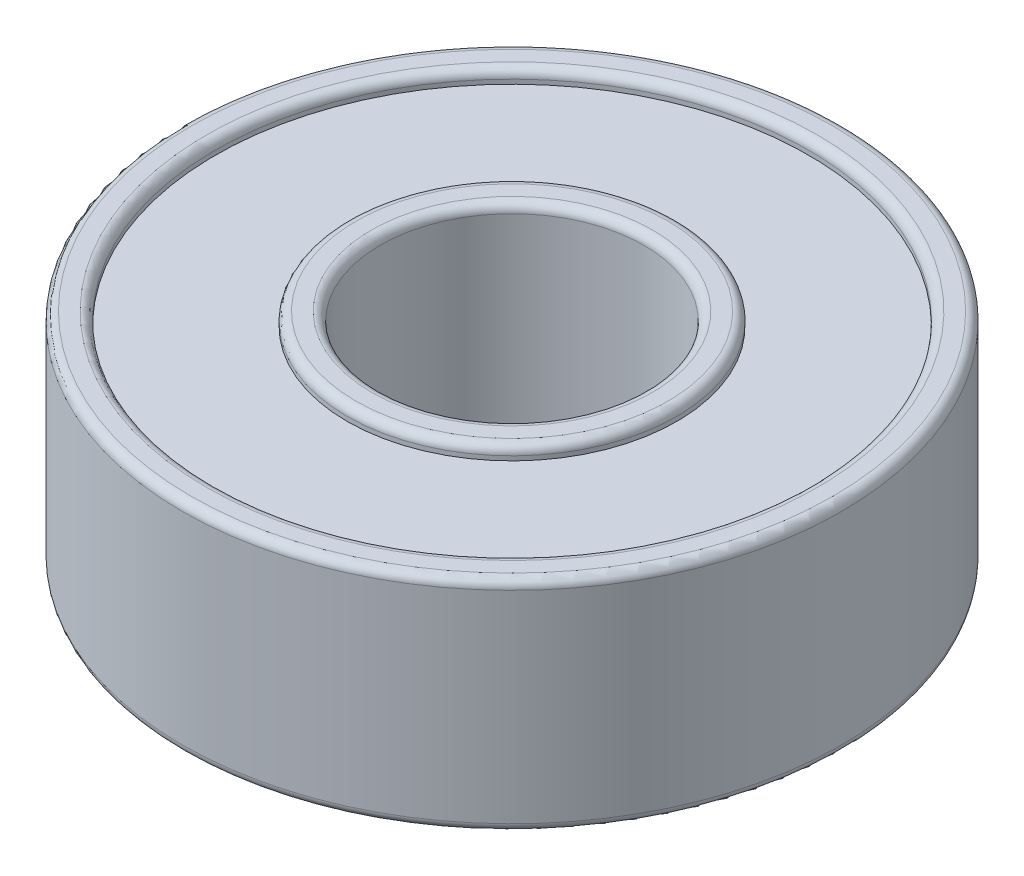
ISO-10303-21;
HEADER;
FILE_DESCRIPTION(('STEP AP214'),'2;1');
FILE_NAME('part.step','',(''),(''),'','','');
FILE_SCHEMA(('AUTOMOTIVE_DESIGN { 1 0 10303 214 1 1 1 1 }'));
ENDSEC;
DATA;
#1=APPLICATION_CONTEXT('core data for automotive mechanical design processes');
#2=APPLICATION_PROTOCOL_DEFINITION('international standard','automotive_design',2000,#1);
#3=PRODUCT_CONTEXT('',#1,'mechanical');
#4=PRODUCT('Part','Part','',(#3));
#5=PRODUCT_RELATED_PRODUCT_CATEGORY('part','',(#4));
#6=PRODUCT_DEFINITION_FORMATION('','',#4);
#7=PRODUCT_DEFINITION_CONTEXT('part definition',#1,'design');
#8=PRODUCT_DEFINITION('design','',#6,#7);
#9=PRODUCT_DEFINITION_SHAPE('','',#8);
#10=(LENGTH_UNIT() NAMED_UNIT(*) SI_UNIT(.MILLI.,.METRE.));
#11=(NAMED_UNIT(*) PLANE_ANGLE_UNIT() SI_UNIT($,.RADIAN.));
#12=(NAMED_UNIT(*) SI_UNIT($,.STERADIAN.) SOLID_ANGLE_UNIT());
#13=UNCERTAINTY_MEASURE_WITH_UNIT(LENGTH_MEASURE(1.E-05),#10,'distance_accuracy_value','');
#14=(GEOMETRIC_REPRESENTATION_CONTEXT(3) GLOBAL_UNCERTAINTY_ASSIGNED_CONTEXT((#13)) GLOBAL_UNIT_ASSIGNED_CONTEXT((#10,
#11,#12)) REPRESENTATION_CONTEXT('',''));
#15=CARTESIAN_POINT('',(0.,0.,0.));
#16=DIRECTION('',(0.,0.,1.));
#17=DIRECTION('',(1.,0.,0.));
#18=AXIS2_PLACEMENT_3D('',#15,#16,#17);
#19=CARTESIAN_POINT('',(0.,-2.5,0.));
#20=DIRECTION('',(0.,1.,0.));
#21=DIRECTION('',(0.,0.,1.));
#22=AXIS2_PLACEMENT_3D('',#19,#20,#21);
#23=PLANE('',#22);
#24=CARTESIAN_POINT('',(0.,-2.5,0.));
#25=DIRECTION('',(0.,1.,0.));
#26=DIRECTION('',(0.,0.,1.));
#27=AXIS2_PLACEMENT_3D('',#24,#25,#26);
#28=CIRCLE('',#27,3.55);
#29=CARTESIAN_POINT('',(0.,-2.5,3.55));
#30=VERTEX_POINT('',#29);
#31=EDGE_CURVE('E78',#30,#30,#28,.F.);
#32=ORIENTED_EDGE('',*,*,#31,.T.);
#33=EDGE_LOOP('',(#32));
#34=FACE_BOUND('',#33,.T.);
#35=CARTESIAN_POINT('',(0.,-2.5,0.));
#36=DIRECTION('',(0.,1.,0.));
#37=DIRECTION('',(0.,0.,1.));
#38=AXIS2_PLACEMENT_3D('',#35,#36,#37);
#39=CIRCLE('',#38,3.2);
#40=CARTESIAN_POINT('',(0.,-2.5,3.2));
#41=VERTEX_POINT('',#40);
#42=EDGE_CURVE('E81',#41,#41,#39,.T.);
#43=ORIENTED_EDGE('',*,*,#42,.T.);
#44=EDGE_LOOP('',(#43));
#45=FACE_BOUND('',#44,.T.);
#46=ADVANCED_FACE('F31',(#34,#45),#23,.F.);
#47=CARTESIAN_POINT('',(0.,2.5,0.));
#48=DIRECTION('',(0.,1.,0.));
#49=DIRECTION('',(0.,0.,1.));
#50=AXIS2_PLACEMENT_3D('',#47,#48,#49);
#51=PLANE('',#50);
#52=CARTESIAN_POINT('',(0.,2.5,0.));
#53=DIRECTION('',(0.,1.,0.));
#54=DIRECTION('',(0.,0.,1.));
#55=AXIS2_PLACEMENT_3D('',#52,#53,#54);
#56=CIRCLE('',#55,3.55);
#57=CARTESIAN_POINT('',(0.,2.5,3.55));
#58=VERTEX_POINT('',#57);
#59=EDGE_CURVE('E63',#58,#58,#56,.T.);
#60=ORIENTED_EDGE('',*,*,#59,.T.);
#61=EDGE_LOOP('',(#60));
#62=FACE_BOUND('',#61,.T.);
#63=CARTESIAN_POINT('',(0.,2.5,0.));
#64=DIRECTION('',(0.,1.,0.));
#65=DIRECTION('',(0.,0.,1.));
#66=AXIS2_PLACEMENT_3D('',#63,#64,#65);
#67=CIRCLE('',#66,3.2);
#68=CARTESIAN_POINT('',(0.,2.5,3.2));
#69=VERTEX_POINT('',#68);
#70=EDGE_CURVE('E66',#69,#69,#67,.F.);
#71=ORIENTED_EDGE('',*,*,#70,.T.);
#72=EDGE_LOOP('',(#71));
#73=FACE_BOUND('',#72,.T.);
#74=ADVANCED_FACE('F119',(#62,#73),#51,.T.);
#75=CARTESIAN_POINT('',(0.,2.5,0.));
#76=DIRECTION('',(0.,1.,0.));
#77=DIRECTION('',(0.,0.,1.));
#78=AXIS2_PLACEMENT_3D('',#75,#76,#77);
#79=CIRCLE('',#78,6.95);
#80=CARTESIAN_POINT('',(0.,2.5,6.95));
#81=VERTEX_POINT('',#80);
#82=EDGE_CURVE('E51',#81,#81,#79,.F.);
#83=ORIENTED_EDGE('',*,*,#82,.T.);
#84=EDGE_LOOP('',(#83));
#85=FACE_BOUND('',#84,.T.);
#86=CARTESIAN_POINT('',(0.,2.5,0.));
#87=DIRECTION('',(0.,1.,0.));
#88=DIRECTION('',(0.,0.,1.));
#89=AXIS2_PLACEMENT_3D('',#86,#87,#88);
#90=CIRCLE('',#89,7.3);
#91=CARTESIAN_POINT('',(0.,2.5,7.3));
#92=VERTEX_POINT('',#91);
#93=EDGE_CURVE('E54',#92,#92,#90,.T.);
#94=ORIENTED_EDGE('',*,*,#93,.T.);
#95=EDGE_LOOP('',(#94));
#96=FACE_BOUND('',#95,.T.);
#97=ADVANCED_FACE('F126',(#85,#96),#51,.T.);
#98=CARTESIAN_POINT('',(0.,-2.5,0.));
#99=DIRECTION('',(0.,1.,0.));
#100=DIRECTION('',(0.,0.,1.));
#101=AXIS2_PLACEMENT_3D('',#98,#99,#100);
#102=CIRCLE('',#101,6.95);
#103=CARTESIAN_POINT('',(0.,-2.5,6.95));
#104=VERTEX_POINT('',#103);
#105=EDGE_CURVE('E72',#104,#104,#102,.T.);
#106=ORIENTED_EDGE('',*,*,#105,.T.);
#107=EDGE_LOOP('',(#106));
#108=FACE_BOUND('',#107,.T.);
#109=CARTESIAN_POINT('',(0.,-2.5,0.));
#110=DIRECTION('',(0.,1.,0.));
#111=DIRECTION('',(0.,0.,1.));
#112=AXIS2_PLACEMENT_3D('',#109,#110,#111);
#113=CIRCLE('',#112,7.3);
#114=CARTESIAN_POINT('',(0.,-2.5,7.3));
#115=VERTEX_POINT('',#114);
#116=EDGE_CURVE('E75',#115,#115,#113,.F.);
#117=ORIENTED_EDGE('',*,*,#116,.T.);
#118=EDGE_LOOP('',(#117));
#119=FACE_BOUND('',#118,.T.);
#120=ADVANCED_FACE('F122',(#108,#119),#23,.F.);
#121=CARTESIAN_POINT('',(0.,2.5,0.));
#122=DIRECTION('',(0.,-1.,0.));
#123=DIRECTION('',(0.,0.,-1.));
#124=AXIS2_PLACEMENT_3D('',#121,#122,#123);
#125=CYLINDRICAL_SURFACE('',#124,7.5);
#126=CARTESIAN_POINT('',(0.,-2.3,0.));
#127=DIRECTION('',(0.,1.,0.));
#128=DIRECTION('',(0.,0.,1.));
#129=AXIS2_PLACEMENT_3D('',#126,#127,#128);
#130=CIRCLE('',#129,7.5);
#131=CARTESIAN_POINT('',(0.,-2.3,7.5));
#132=VERTEX_POINT('',#131);
#133=EDGE_CURVE('E10',#132,#132,#130,.T.);
#134=ORIENTED_EDGE('',*,*,#133,.T.);
#135=EDGE_LOOP('',(#134));
#136=FACE_BOUND('',#135,.T.);
#137=CARTESIAN_POINT('',(0.,2.3,0.));
#138=DIRECTION('',(0.,1.,0.));
#139=DIRECTION('',(0.,0.,1.));
#140=AXIS2_PLACEMENT_3D('',#137,#138,#139);
#141=CIRCLE('',#140,7.5);
#142=CARTESIAN_POINT('',(0.,2.3,7.5));
#143=VERTEX_POINT('',#142);
#144=EDGE_CURVE('E38',#143,#143,#141,.F.);
#145=ORIENTED_EDGE('',*,*,#144,.T.);
#146=EDGE_LOOP('',(#145));
#147=FACE_BOUND('',#146,.T.);
#148=ADVANCED_FACE('F132',(#136,#147),#125,.T.);
#149=CARTESIAN_POINT('',(0.,2.5,0.));
#150=DIRECTION('',(0.,-1.,0.));
#151=DIRECTION('',(0.,0.,-1.));
#152=AXIS2_PLACEMENT_3D('',#149,#150,#151);
#153=CYLINDRICAL_SURFACE('',#152,3.);
#154=CARTESIAN_POINT('',(0.,-2.3,0.));
#155=DIRECTION('',(0.,1.,0.));
#156=DIRECTION('',(0.,0.,1.));
#157=AXIS2_PLACEMENT_3D('',#154,#155,#156);
#158=CIRCLE('',#157,3.);
#159=CARTESIAN_POINT('',(0.,-2.3,3.));
#160=VERTEX_POINT('',#159);
#161=EDGE_CURVE('E42',#160,#160,#158,.F.);
#162=ORIENTED_EDGE('',*,*,#161,.T.);
#163=EDGE_LOOP('',(#162));
#164=FACE_BOUND('',#163,.T.);
#165=CARTESIAN_POINT('',(0.,2.3,0.));
#166=DIRECTION('',(0.,1.,0.));
#167=DIRECTION('',(0.,0.,1.));
#168=AXIS2_PLACEMENT_3D('',#165,#166,#167);
#169=CIRCLE('',#168,3.);
#170=CARTESIAN_POINT('',(0.,2.3,3.));
#171=VERTEX_POINT('',#170);
#172=EDGE_CURVE('E46',#171,#171,#169,.T.);
#173=ORIENTED_EDGE('',*,*,#172,.T.);
#174=EDGE_LOOP('',(#173));
#175=FACE_BOUND('',#174,.T.);
#176=ADVANCED_FACE('F138',(#164,#175),#153,.F.);
#177=CARTESIAN_POINT('',(0.,2.2,0.));
#178=DIRECTION('',(0.,1.,0.));
#179=DIRECTION('',(0.,0.,1.));
#180=AXIS2_PLACEMENT_3D('',#177,#178,#179);
#181=CYLINDRICAL_SURFACE('',#180,3.75);
#182=CARTESIAN_POINT('',(0.,2.3,0.));
#183=DIRECTION('',(0.,1.,0.));
#184=DIRECTION('',(0.,0.,1.));
#185=AXIS2_PLACEMENT_3D('',#182,#183,#184);
#186=CIRCLE('',#185,3.75);
#187=CARTESIAN_POINT('',(0.,2.3,3.75));
#188=VERTEX_POINT('',#187);
#189=EDGE_CURVE('E60',#188,#188,#186,.F.);
#190=ORIENTED_EDGE('',*,*,#189,.T.);
#191=EDGE_LOOP('',(#190));
#192=FACE_BOUND('',#191,.T.);
#193=CARTESIAN_POINT('',(0.,2.2,0.));
#194=DIRECTION('',(0.,1.,0.));
#195=DIRECTION('',(0.,0.,1.));
#196=AXIS2_PLACEMENT_3D('',#193,#194,#195);
#197=CIRCLE('',#196,3.75);
#198=CARTESIAN_POINT('',(0.,2.2,3.75));
#199=VERTEX_POINT('',#198);
#200=EDGE_CURVE('E90',#199,#199,#197,.T.);
#201=ORIENTED_EDGE('',*,*,#200,.T.);
#202=EDGE_LOOP('',(#201));
#203=FACE_BOUND('',#202,.T.);
#204=ADVANCED_FACE('F249',(#192,#203),#181,.T.);
#205=CARTESIAN_POINT('',(0.,2.2,0.));
#206=DIRECTION('',(0.,1.,0.));
#207=DIRECTION('',(0.,0.,1.));
#208=AXIS2_PLACEMENT_3D('',#205,#206,#207);
#209=CYLINDRICAL_SURFACE('',#208,6.75);
#210=CARTESIAN_POINT('',(0.,2.3,0.));
#211=DIRECTION('',(0.,1.,0.));
#212=DIRECTION('',(0.,0.,1.));
#213=AXIS2_PLACEMENT_3D('',#210,#211,#212);
#214=CIRCLE('',#213,6.75);
#215=CARTESIAN_POINT('',(0.,2.3,6.75));
#216=VERTEX_POINT('',#215);
#217=EDGE_CURVE('E57',#216,#216,#214,.T.);
#218=ORIENTED_EDGE('',*,*,#217,.T.);
#219=EDGE_LOOP('',(#218));
#220=FACE_BOUND('',#219,.T.);
#221=CARTESIAN_POINT('',(0.,2.2,0.));
#222=DIRECTION('',(0.,1.,0.));
#223=DIRECTION('',(0.,0.,1.));
#224=AXIS2_PLACEMENT_3D('',#221,#222,#223);
#225=CIRCLE('',#224,6.75);
#226=CARTESIAN_POINT('',(0.,2.2,6.75));
#227=VERTEX_POINT('',#226);
#228=EDGE_CURVE('E87',#227,#227,#225,.T.);
#229=ORIENTED_EDGE('',*,*,#228,.F.);
#230=EDGE_LOOP('',(#229));
#231=FACE_BOUND('',#230,.T.);
#232=ADVANCED_FACE('F115',(#220,#231),#209,.F.);
#233=CARTESIAN_POINT('',(0.,2.2,0.));
#234=DIRECTION('',(0.,1.,0.));
#235=DIRECTION('',(0.,0.,1.));
#236=AXIS2_PLACEMENT_3D('',#233,#234,#235);
#237=PLANE('',#236);
#238=ORIENTED_EDGE('',*,*,#200,.F.);
#239=EDGE_LOOP('',(#238));
#240=FACE_BOUND('',#239,.T.);
#241=ORIENTED_EDGE('',*,*,#228,.T.);
#242=EDGE_LOOP('',(#241));
#243=FACE_BOUND('',#242,.T.);
#244=ADVANCED_FACE('F106',(#240,#243),#237,.T.);
#245=CARTESIAN_POINT('',(0.,-2.2,0.));
#246=DIRECTION('',(0.,-1.,0.));
#247=DIRECTION('',(0.,0.,-1.));
#248=AXIS2_PLACEMENT_3D('',#245,#246,#247);
#249=CYLINDRICAL_SURFACE('',#248,3.75);
#250=CARTESIAN_POINT('',(0.,-2.3,0.));
#251=DIRECTION('',(0.,1.,0.));
#252=DIRECTION('',(0.,0.,1.));
#253=AXIS2_PLACEMENT_3D('',#250,#251,#252);
#254=CIRCLE('',#253,3.75);
#255=CARTESIAN_POINT('',(0.,-2.3,3.75));
#256=VERTEX_POINT('',#255);
#257=EDGE_CURVE('E84',#256,#256,#254,.T.);
#258=ORIENTED_EDGE('',*,*,#257,.T.);
#259=EDGE_LOOP('',(#258));
#260=FACE_BOUND('',#259,.T.);
#261=CARTESIAN_POINT('',(0.,-2.2,0.));
#262=DIRECTION('',(0.,1.,0.));
#263=DIRECTION('',(0.,0.,1.));
#264=AXIS2_PLACEMENT_3D('',#261,#262,#263);
#265=CIRCLE('',#264,3.75);
#266=CARTESIAN_POINT('',(0.,-2.2,3.75));
#267=VERTEX_POINT('',#266);
#268=EDGE_CURVE('E96',#267,#267,#265,.T.);
#269=ORIENTED_EDGE('',*,*,#268,.F.);
#270=EDGE_LOOP('',(#269));
#271=FACE_BOUND('',#270,.T.);
#272=ADVANCED_FACE('F103',(#260,#271),#249,.T.);
#273=CARTESIAN_POINT('',(0.,-2.2,0.));
#274=DIRECTION('',(0.,-1.,0.));
#275=DIRECTION('',(0.,0.,-1.));
#276=AXIS2_PLACEMENT_3D('',#273,#274,#275);
#277=CYLINDRICAL_SURFACE('',#276,6.75);
#278=CARTESIAN_POINT('',(0.,-2.3,0.));
#279=DIRECTION('',(0.,1.,0.));
#280=DIRECTION('',(0.,0.,1.));
#281=AXIS2_PLACEMENT_3D('',#278,#279,#280);
#282=CIRCLE('',#281,6.75);
#283=CARTESIAN_POINT('',(0.,-2.3,6.75));
#284=VERTEX_POINT('',#283);
#285=EDGE_CURVE('E69',#284,#284,#282,.F.);
#286=ORIENTED_EDGE('',*,*,#285,.T.);
#287=EDGE_LOOP('',(#286));
#288=FACE_BOUND('',#287,.T.);
#289=CARTESIAN_POINT('',(0.,-2.2,0.));
#290=DIRECTION('',(0.,1.,0.));
#291=DIRECTION('',(0.,0.,1.));
#292=AXIS2_PLACEMENT_3D('',#289,#290,#291);
#293=CIRCLE('',#292,6.75);
#294=CARTESIAN_POINT('',(0.,-2.2,6.75));
#295=VERTEX_POINT('',#294);
#296=EDGE_CURVE('E93',#295,#295,#293,.T.);
#297=ORIENTED_EDGE('',*,*,#296,.T.);
#298=EDGE_LOOP('',(#297));
#299=FACE_BOUND('',#298,.T.);
#300=ADVANCED_FACE('F105',(#288,#299),#277,.F.);
#301=CARTESIAN_POINT('',(0.,-2.2,0.));
#302=DIRECTION('',(0.,-1.,0.));
#303=DIRECTION('',(0.,0.,1.));
#304=AXIS2_PLACEMENT_3D('',#301,#302,#303);
#305=PLANE('',#304);
#306=ORIENTED_EDGE('',*,*,#268,.T.);
#307=EDGE_LOOP('',(#306));
#308=FACE_BOUND('',#307,.T.);
#309=ORIENTED_EDGE('',*,*,#296,.F.);
#310=EDGE_LOOP('',(#309));
#311=FACE_BOUND('',#310,.T.);
#312=ADVANCED_FACE('F100',(#308,#311),#305,.T.);
#313=CARTESIAN_POINT('',(0.,-2.3,0.));
#314=DIRECTION('',(0.,1.,0.));
#315=DIRECTION('',(0.,0.,1.));
#316=AXIS2_PLACEMENT_3D('',#313,#314,#315);
#317=TOROIDAL_SURFACE('',#316,3.55,0.2);
#318=ORIENTED_EDGE('',*,*,#31,.F.);
#319=EDGE_LOOP('',(#318));
#320=FACE_BOUND('',#319,.T.);
#321=ORIENTED_EDGE('',*,*,#257,.F.);
#322=EDGE_LOOP('',(#321));
#323=FACE_BOUND('',#322,.T.);
#324=ADVANCED_FACE('F171',(#320,#323),#317,.T.);
#325=CARTESIAN_POINT('',(0.,-2.3,0.));
#326=DIRECTION('',(0.,1.,0.));
#327=DIRECTION('',(0.,0.,1.));
#328=AXIS2_PLACEMENT_3D('',#325,#326,#327);
#329=TOROIDAL_SURFACE('',#328,6.95,0.2);
#330=ORIENTED_EDGE('',*,*,#285,.F.);
#331=EDGE_LOOP('',(#330));
#332=FACE_BOUND('',#331,.T.);
#333=ORIENTED_EDGE('',*,*,#105,.F.);
#334=EDGE_LOOP('',(#333));
#335=FACE_BOUND('',#334,.T.);
#336=ADVANCED_FACE('F167',(#332,#335),#329,.T.);
#337=CARTESIAN_POINT('',(0.,2.3,0.));
#338=DIRECTION('',(0.,1.,0.));
#339=DIRECTION('',(0.,0.,1.));
#340=AXIS2_PLACEMENT_3D('',#337,#338,#339);
#341=TOROIDAL_SURFACE('',#340,3.55,0.2);
#342=ORIENTED_EDGE('',*,*,#189,.F.);
#343=EDGE_LOOP('',(#342));
#344=FACE_BOUND('',#343,.T.);
#345=ORIENTED_EDGE('',*,*,#59,.F.);
#346=EDGE_LOOP('',(#345));
#347=FACE_BOUND('',#346,.T.);
#348=ADVANCED_FACE('F163',(#344,#347),#341,.T.);
#349=CARTESIAN_POINT('',(0.,2.3,0.));
#350=DIRECTION('',(0.,1.,0.));
#351=DIRECTION('',(0.,0.,1.));
#352=AXIS2_PLACEMENT_3D('',#349,#350,#351);
#353=TOROIDAL_SURFACE('',#352,6.95,0.2);
#354=ORIENTED_EDGE('',*,*,#82,.F.);
#355=EDGE_LOOP('',(#354));
#356=FACE_BOUND('',#355,.T.);
#357=ORIENTED_EDGE('',*,*,#217,.F.);
#358=EDGE_LOOP('',(#357));
#359=FACE_BOUND('',#358,.T.);
#360=ADVANCED_FACE('F159',(#356,#359),#353,.T.);
#361=CARTESIAN_POINT('',(0.,-2.3,0.));
#362=DIRECTION('',(0.,1.,0.));
#363=DIRECTION('',(0.,0.,1.));
#364=AXIS2_PLACEMENT_3D('',#361,#362,#363);
#365=TOROIDAL_SURFACE('',#364,3.2,0.2);
#366=ORIENTED_EDGE('',*,*,#161,.F.);
#367=EDGE_LOOP('',(#366));
#368=FACE_BOUND('',#367,.T.);
#369=ORIENTED_EDGE('',*,*,#42,.F.);
#370=EDGE_LOOP('',(#369));
#371=FACE_BOUND('',#370,.T.);
#372=ADVANCED_FACE('F153',(#368,#371),#365,.T.);
#373=CARTESIAN_POINT('',(0.,2.3,0.));
#374=DIRECTION('',(0.,1.,0.));
#375=DIRECTION('',(0.,0.,1.));
#376=AXIS2_PLACEMENT_3D('',#373,#374,#375);
#377=TOROIDAL_SURFACE('',#376,3.2,0.2);
#378=ORIENTED_EDGE('',*,*,#70,.F.);
#379=EDGE_LOOP('',(#378));
#380=FACE_BOUND('',#379,.T.);
#381=ORIENTED_EDGE('',*,*,#172,.F.);
#382=EDGE_LOOP('',(#381));
#383=FACE_BOUND('',#382,.T.);
#384=ADVANCED_FACE('F147',(#380,#383),#377,.T.);
#385=CARTESIAN_POINT('',(0.,-2.3,0.));
#386=DIRECTION('',(0.,1.,0.));
#387=DIRECTION('',(0.,0.,1.));
#388=AXIS2_PLACEMENT_3D('',#385,#386,#387);
#389=TOROIDAL_SURFACE('',#388,7.3,0.2);
#390=ORIENTED_EDGE('',*,*,#116,.F.);
#391=EDGE_LOOP('',(#390));
#392=FACE_BOUND('',#391,.T.);
#393=ORIENTED_EDGE('',*,*,#133,.F.);
#394=EDGE_LOOP('',(#393));
#395=FACE_BOUND('',#394,.T.);
#396=ADVANCED_FACE('F144',(#392,#395),#389,.T.);
#397=CARTESIAN_POINT('',(0.,2.3,0.));
#398=DIRECTION('',(0.,1.,0.));
#399=DIRECTION('',(0.,0.,1.));
#400=AXIS2_PLACEMENT_3D('',#397,#398,#399);
#401=TOROIDAL_SURFACE('',#400,7.3,0.2);
#402=ORIENTED_EDGE('',*,*,#144,.F.);
#403=EDGE_LOOP('',(#402));
#404=FACE_BOUND('',#403,.T.);
#405=ORIENTED_EDGE('',*,*,#93,.F.);
#406=EDGE_LOOP('',(#405));
#407=FACE_BOUND('',#406,.T.);
#408=ADVANCED_FACE('F33',(#404,#407),#401,.T.);
#409=CLOSED_SHELL('',(#46,#74,#97,#120,#148,#176,#204,#232,#244,#272,#300,#312,#324,#336,#348,
#360,#372,#384,#396,#408));
#410=MANIFOLD_SOLID_BREP('B2',#409);
#411=ADVANCED_BREP_SHAPE_REPRESENTATION('',(#18,#410),#14);
#412=SHAPE_DEFINITION_REPRESENTATION(#9,#411);
ENDSEC;
END-ISO-10303-21;
